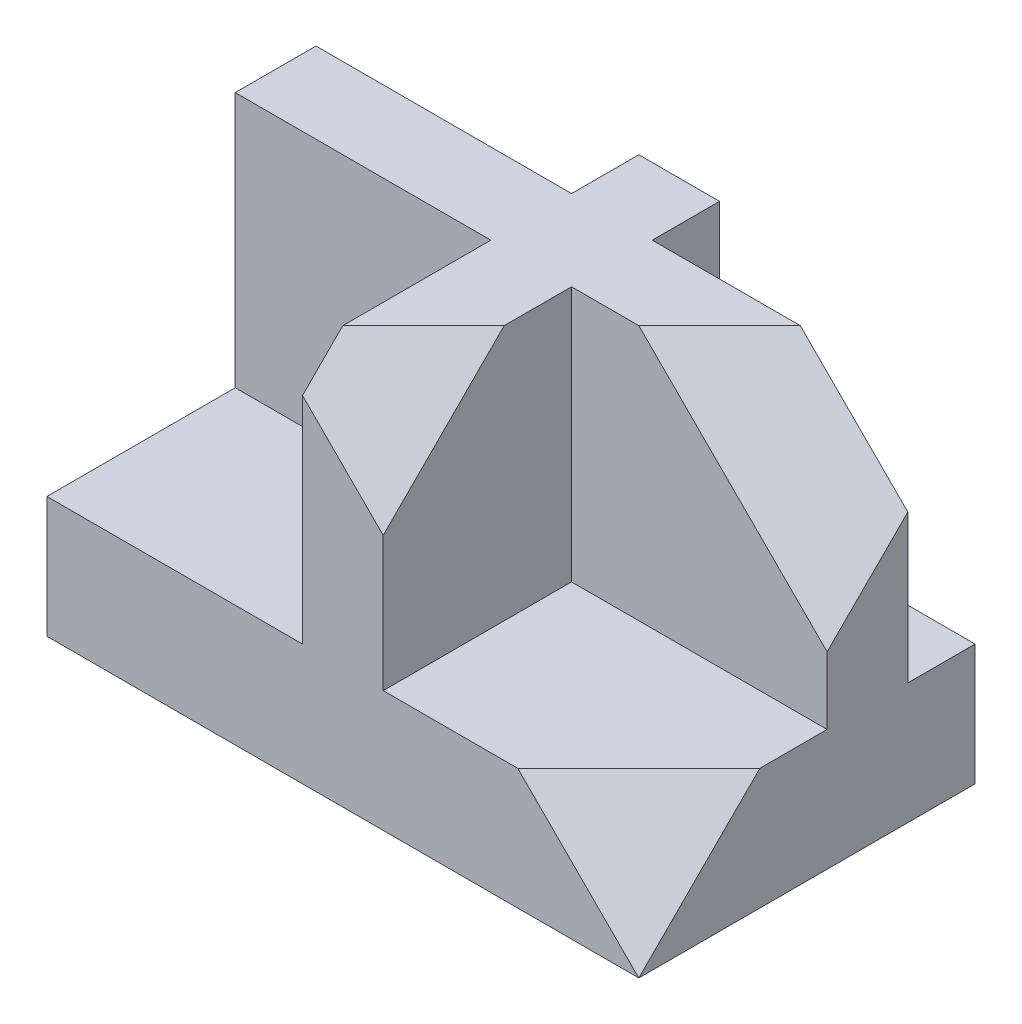
ISO-10303-21;
HEADER;
FILE_DESCRIPTION(('STEP AP214'),'2;1');
FILE_NAME('part.step','',(''),(''),'','','');
FILE_SCHEMA(('AUTOMOTIVE_DESIGN { 1 0 10303 214 1 1 1 1 }'));
ENDSEC;
DATA;
#1=APPLICATION_CONTEXT('core data for automotive mechanical design processes');
#2=APPLICATION_PROTOCOL_DEFINITION('international standard','automotive_design',2000,#1);
#3=PRODUCT_CONTEXT('',#1,'mechanical');
#4=PRODUCT('Part','Part','',(#3));
#5=PRODUCT_RELATED_PRODUCT_CATEGORY('part','',(#4));
#6=PRODUCT_DEFINITION_FORMATION('','',#4);
#7=PRODUCT_DEFINITION_CONTEXT('part definition',#1,'design');
#8=PRODUCT_DEFINITION('design','',#6,#7);
#9=PRODUCT_DEFINITION_SHAPE('','',#8);
#10=(LENGTH_UNIT() NAMED_UNIT(*) SI_UNIT(.MILLI.,.METRE.));
#11=(NAMED_UNIT(*) PLANE_ANGLE_UNIT() SI_UNIT($,.RADIAN.));
#12=(NAMED_UNIT(*) SI_UNIT($,.STERADIAN.) SOLID_ANGLE_UNIT());
#13=UNCERTAINTY_MEASURE_WITH_UNIT(LENGTH_MEASURE(1.E-05),#10,'distance_accuracy_value','');
#14=(GEOMETRIC_REPRESENTATION_CONTEXT(3) GLOBAL_UNCERTAINTY_ASSIGNED_CONTEXT((#13)) GLOBAL_UNIT_ASSIGNED_CONTEXT((#10,
#11,#12)) REPRESENTATION_CONTEXT('',''));
#15=CARTESIAN_POINT('',(0.,0.,0.));
#16=DIRECTION('',(0.,0.,1.));
#17=DIRECTION('',(1.,0.,0.));
#18=AXIS2_PLACEMENT_3D('',#15,#16,#17);
#19=CARTESIAN_POINT('',(0.,0.,0.));
#20=DIRECTION('',(0.,1.,0.));
#21=DIRECTION('',(0.,0.,1.));
#22=AXIS2_PLACEMENT_3D('',#19,#20,#21);
#23=PLANE('',#22);
#24=DIRECTION('',(1.,0.,0.));
#25=VECTOR('',#24,1.);
#26=CARTESIAN_POINT('',(0.,0.,25.));
#27=LINE('',#26,#25);
#28=CARTESIAN_POINT('',(6.,0.,25.));
#29=VERTEX_POINT('',#28);
#30=CARTESIAN_POINT('',(25.9999999999998,0.,25.));
#31=VERTEX_POINT('',#30);
#32=EDGE_CURVE('E280',#29,#31,#27,.T.);
#33=ORIENTED_EDGE('',*,*,#32,.T.);
#34=DIRECTION('',(0.707106781186548,0.,-0.707106781186547));
#35=VECTOR('',#34,1.);
#36=CARTESIAN_POINT('',(25.4999999999999,0.,25.4999999999999));
#37=LINE('',#36,#35);
#38=CARTESIAN_POINT('',(44.,0.,6.99999999999985));
#39=VERTEX_POINT('',#38);
#40=EDGE_CURVE('E55',#31,#39,#37,.T.);
#41=ORIENTED_EDGE('',*,*,#40,.T.);
#42=DIRECTION('',(0.,0.,1.));
#43=VECTOR('',#42,1.);
#44=CARTESIAN_POINT('',(44.,0.,0.));
#45=LINE('',#44,#43);
#46=CARTESIAN_POINT('',(44.,0.,-2.99999999999999));
#47=VERTEX_POINT('',#46);
#48=EDGE_CURVE('E284',#47,#39,#45,.T.);
#49=ORIENTED_EDGE('',*,*,#48,.F.);
#50=DIRECTION('',(1.,0.,0.));
#51=VECTOR('',#50,1.);
#52=CARTESIAN_POINT('',(0.,0.,-2.99999999999999));
#53=LINE('',#52,#51);
#54=CARTESIAN_POINT('',(6.,0.,-2.99999999999999));
#55=VERTEX_POINT('',#54);
#56=EDGE_CURVE('E217',#55,#47,#53,.T.);
#57=ORIENTED_EDGE('',*,*,#56,.F.);
#58=DIRECTION('',(0.,0.,1.));
#59=VECTOR('',#58,1.);
#60=CARTESIAN_POINT('',(6.,0.,0.));
#61=LINE('',#60,#59);
#62=EDGE_CURVE('E214',#55,#29,#61,.T.);
#63=ORIENTED_EDGE('',*,*,#62,.T.);
#64=EDGE_LOOP('',(#33,#41,#49,#57,#63));
#65=FACE_BOUND('',#64,.T.);
#66=ADVANCED_FACE('F40',(#65),#23,.T.);
#67=CARTESIAN_POINT('',(44.,-18.,0.));
#68=DIRECTION('',(-1.,0.,0.));
#69=DIRECTION('',(0.,0.,1.));
#70=AXIS2_PLACEMENT_3D('',#67,#68,#69);
#71=PLANE('',#70);
#72=DIRECTION('',(0.,0.707106781186544,-0.707106781186551));
#73=VECTOR('',#72,1.);
#74=CARTESIAN_POINT('',(44.,-5.49999999999998,12.4999999999999));
#75=LINE('',#74,#73);
#76=CARTESIAN_POINT('',(44.,-18.,25.));
#77=VERTEX_POINT('',#76);
#78=EDGE_CURVE('E326',#77,#39,#75,.T.);
#79=ORIENTED_EDGE('',*,*,#78,.F.);
#80=DIRECTION('',(0.,0.,1.));
#81=VECTOR('',#80,1.);
#82=CARTESIAN_POINT('',(44.,-18.,0.));
#83=LINE('',#82,#81);
#84=CARTESIAN_POINT('',(44.,-18.,-25.));
#85=VERTEX_POINT('',#84);
#86=EDGE_CURVE('E270',#85,#77,#83,.T.);
#87=ORIENTED_EDGE('',*,*,#86,.F.);
#88=DIRECTION('',(0.,1.,0.));
#89=VECTOR('',#88,1.);
#90=CARTESIAN_POINT('',(44.,-18.,-25.));
#91=LINE('',#90,#89);
#92=CARTESIAN_POINT('',(44.,0.,-25.));
#93=VERTEX_POINT('',#92);
#94=EDGE_CURVE('E173',#85,#93,#91,.T.);
#95=ORIENTED_EDGE('',*,*,#94,.T.);
#96=CARTESIAN_POINT('',(44.,0.,-15.));
#97=VERTEX_POINT('',#96);
#98=EDGE_CURVE('E264',#93,#97,#45,.T.);
#99=ORIENTED_EDGE('',*,*,#98,.T.);
#100=DIRECTION('',(0.,-1.,0.));
#101=VECTOR('',#100,1.);
#102=CARTESIAN_POINT('',(44.,38.,-15.));
#103=LINE('',#102,#101);
#104=CARTESIAN_POINT('',(44.,21.9999999999996,-15.));
#105=VERTEX_POINT('',#104);
#106=EDGE_CURVE('E244',#105,#97,#103,.T.);
#107=ORIENTED_EDGE('',*,*,#106,.F.);
#108=CARTESIAN_POINT('',(44.,9.99999999999972,-2.99999999999999));
#109=VERTEX_POINT('',#108);
#110=EDGE_CURVE('E183',#109,#105,#75,.T.);
#111=ORIENTED_EDGE('',*,*,#110,.F.);
#112=DIRECTION('',(0.,-1.,0.));
#113=VECTOR('',#112,1.);
#114=CARTESIAN_POINT('',(44.,38.,-2.99999999999999));
#115=LINE('',#114,#113);
#116=EDGE_CURVE('E182',#109,#47,#115,.T.);
#117=ORIENTED_EDGE('',*,*,#116,.T.);
#118=ORIENTED_EDGE('',*,*,#48,.T.);
#119=EDGE_LOOP('',(#79,#87,#95,#99,#107,#111,#117,#118));
#120=FACE_BOUND('',#119,.T.);
#121=ADVANCED_FACE('F323',(#120),#71,.F.);
#122=CARTESIAN_POINT('',(0.,-18.,25.));
#123=DIRECTION('',(0.,0.,1.));
#124=DIRECTION('',(1.,0.,0.));
#125=AXIS2_PLACEMENT_3D('',#122,#123,#124);
#126=PLANE('',#125);
#127=DIRECTION('',(1.,0.,0.));
#128=VECTOR('',#127,1.);
#129=CARTESIAN_POINT('',(0.,-18.,25.));
#130=LINE('',#129,#128);
#131=CARTESIAN_POINT('',(-44.,-18.,25.));
#132=VERTEX_POINT('',#131);
#133=EDGE_CURVE('E267',#132,#77,#130,.T.);
#134=ORIENTED_EDGE('',*,*,#133,.T.);
#135=DIRECTION('',(-0.707106781186551,0.707106781186544,0.));
#136=VECTOR('',#135,1.);
#137=CARTESIAN_POINT('',(21.9999999999998,4.00000000000001,25.));
#138=LINE('',#137,#136);
#139=EDGE_CURVE('E364',#77,#31,#138,.T.);
#140=ORIENTED_EDGE('',*,*,#139,.T.);
#141=ORIENTED_EDGE('',*,*,#32,.F.);
#142=DIRECTION('',(0.,-1.,0.));
#143=VECTOR('',#142,1.);
#144=CARTESIAN_POINT('',(6.,38.,25.));
#145=LINE('',#144,#143);
#146=CARTESIAN_POINT('',(6.,19.9999999999996,25.));
#147=VERTEX_POINT('',#146);
#148=EDGE_CURVE('E249',#147,#29,#145,.T.);
#149=ORIENTED_EDGE('',*,*,#148,.F.);
#150=CARTESIAN_POINT('',(-6.,31.9999999999995,25.));
#151=VERTEX_POINT('',#150);
#152=EDGE_CURVE('E365',#147,#151,#138,.T.);
#153=ORIENTED_EDGE('',*,*,#152,.T.);
#154=DIRECTION('',(0.,-1.,0.));
#155=VECTOR('',#154,1.);
#156=CARTESIAN_POINT('',(-6.,38.,25.));
#157=LINE('',#156,#155);
#158=CARTESIAN_POINT('',(-6.,0.,25.));
#159=VERTEX_POINT('',#158);
#160=EDGE_CURVE('E251',#151,#159,#157,.T.);
#161=ORIENTED_EDGE('',*,*,#160,.T.);
#162=CARTESIAN_POINT('',(-44.,0.,25.));
#163=VERTEX_POINT('',#162);
#164=EDGE_CURVE('E281',#163,#159,#27,.T.);
#165=ORIENTED_EDGE('',*,*,#164,.F.);
#166=DIRECTION('',(0.,1.,0.));
#167=VECTOR('',#166,1.);
#168=CARTESIAN_POINT('',(-44.,-18.,25.));
#169=LINE('',#168,#167);
#170=EDGE_CURVE('E289',#132,#163,#169,.T.);
#171=ORIENTED_EDGE('',*,*,#170,.F.);
#172=EDGE_LOOP('',(#134,#140,#141,#149,#153,#161,#165,#171));
#173=FACE_BOUND('',#172,.T.);
#174=ADVANCED_FACE('F333',(#173),#126,.T.);
#175=CARTESIAN_POINT('',(-6.,38.,0.));
#176=DIRECTION('',(1.,0.,0.));
#177=DIRECTION('',(0.,0.,-1.));
#178=AXIS2_PLACEMENT_3D('',#175,#176,#177);
#179=PLANE('',#178);
#180=DIRECTION('',(0.,-0.707106781186544,0.707106781186551));
#181=VECTOR('',#180,1.);
#182=CARTESIAN_POINT('',(-6.,47.4999999999997,9.49999999999961));
#183=LINE('',#182,#181);
#184=CARTESIAN_POINT('',(-6.,38.,18.9999999999994));
#185=VERTEX_POINT('',#184);
#186=EDGE_CURVE('E362',#185,#151,#183,.T.);
#187=ORIENTED_EDGE('',*,*,#186,.F.);
#188=DIRECTION('',(0.,0.,1.));
#189=VECTOR('',#188,1.);
#190=CARTESIAN_POINT('',(-6.,38.,0.));
#191=LINE('',#190,#189);
#192=CARTESIAN_POINT('',(-6.,38.,-2.99999999999999));
#193=VERTEX_POINT('',#192);
#194=EDGE_CURVE('E193',#193,#185,#191,.T.);
#195=ORIENTED_EDGE('',*,*,#194,.F.);
#196=DIRECTION('',(0.,-1.,0.));
#197=VECTOR('',#196,1.);
#198=CARTESIAN_POINT('',(-6.,38.,-2.99999999999999));
#199=LINE('',#198,#197);
#200=CARTESIAN_POINT('',(-6.,0.,-2.99999999999999));
#201=VERTEX_POINT('',#200);
#202=EDGE_CURVE('E253',#193,#201,#199,.T.);
#203=ORIENTED_EDGE('',*,*,#202,.T.);
#204=DIRECTION('',(0.,0.,1.));
#205=VECTOR('',#204,1.);
#206=CARTESIAN_POINT('',(-6.,0.,0.));
#207=LINE('',#206,#205);
#208=EDGE_CURVE('E211',#201,#159,#207,.T.);
#209=ORIENTED_EDGE('',*,*,#208,.T.);
#210=ORIENTED_EDGE('',*,*,#160,.F.);
#211=EDGE_LOOP('',(#187,#195,#203,#209,#210));
#212=FACE_BOUND('',#211,.T.);
#213=ADVANCED_FACE('F340',(#212),#179,.F.);
#214=CARTESIAN_POINT('',(6.,38.,0.));
#215=DIRECTION('',(1.,0.,0.));
#216=DIRECTION('',(0.,0.,-1.));
#217=AXIS2_PLACEMENT_3D('',#214,#215,#216);
#218=PLANE('',#217);
#219=DIRECTION('',(0.,0.,1.));
#220=VECTOR('',#219,1.);
#221=CARTESIAN_POINT('',(6.,38.,0.));
#222=LINE('',#221,#220);
#223=CARTESIAN_POINT('',(6.,38.,-2.99999999999999));
#224=VERTEX_POINT('',#223);
#225=CARTESIAN_POINT('',(6.,38.,6.99999999999942));
#226=VERTEX_POINT('',#225);
#227=EDGE_CURVE('E188',#224,#226,#222,.T.);
#228=ORIENTED_EDGE('',*,*,#227,.T.);
#229=DIRECTION('',(0.,-0.707106781186544,0.707106781186551));
#230=VECTOR('',#229,1.);
#231=CARTESIAN_POINT('',(6.,41.4999999999997,3.49999999999967));
#232=LINE('',#231,#230);
#233=EDGE_CURVE('E354',#226,#147,#232,.T.);
#234=ORIENTED_EDGE('',*,*,#233,.T.);
#235=ORIENTED_EDGE('',*,*,#148,.T.);
#236=ORIENTED_EDGE('',*,*,#62,.F.);
#237=DIRECTION('',(0.,-1.,0.));
#238=VECTOR('',#237,1.);
#239=CARTESIAN_POINT('',(6.,38.,-2.99999999999999));
#240=LINE('',#239,#238);
#241=EDGE_CURVE('E247',#224,#55,#240,.T.);
#242=ORIENTED_EDGE('',*,*,#241,.F.);
#243=EDGE_LOOP('',(#228,#234,#235,#236,#242));
#244=FACE_BOUND('',#243,.T.);
#245=ADVANCED_FACE('F353',(#244),#218,.T.);
#246=CARTESIAN_POINT('',(0.,38.,-2.99999999999999));
#247=DIRECTION('',(0.,0.,-1.));
#248=DIRECTION('',(-1.,0.,0.));
#249=AXIS2_PLACEMENT_3D('',#246,#247,#248);
#250=PLANE('',#249);
#251=DIRECTION('',(0.707106781186551,-0.707106781186544,0.));
#252=VECTOR('',#251,1.);
#253=CARTESIAN_POINT('',(7.99999999999962,45.9999999999997,-2.99999999999999));
#254=LINE('',#253,#252);
#255=CARTESIAN_POINT('',(15.9999999999994,38.,-2.99999999999999));
#256=VERTEX_POINT('',#255);
#257=EDGE_CURVE('E167',#256,#109,#254,.T.);
#258=ORIENTED_EDGE('',*,*,#257,.F.);
#259=DIRECTION('',(1.,0.,0.));
#260=VECTOR('',#259,1.);
#261=CARTESIAN_POINT('',(0.,38.,-2.99999999999999));
#262=LINE('',#261,#260);
#263=EDGE_CURVE('E179',#224,#256,#262,.T.);
#264=ORIENTED_EDGE('',*,*,#263,.F.);
#265=ORIENTED_EDGE('',*,*,#241,.T.);
#266=ORIENTED_EDGE('',*,*,#56,.T.);
#267=ORIENTED_EDGE('',*,*,#116,.F.);
#268=EDGE_LOOP('',(#258,#264,#265,#266,#267));
#269=FACE_BOUND('',#268,.T.);
#270=ADVANCED_FACE('F177',(#269),#250,.F.);
#271=CARTESIAN_POINT('',(0.,38.,-15.));
#272=DIRECTION('',(0.,0.,-1.));
#273=DIRECTION('',(-1.,0.,0.));
#274=AXIS2_PLACEMENT_3D('',#271,#272,#273);
#275=PLANE('',#274);
#276=DIRECTION('',(1.,0.,0.));
#277=VECTOR('',#276,1.);
#278=CARTESIAN_POINT('',(0.,38.,-15.));
#279=LINE('',#278,#277);
#280=CARTESIAN_POINT('',(6.,38.,-15.));
#281=VERTEX_POINT('',#280);
#282=CARTESIAN_POINT('',(27.9999999999994,38.,-15.));
#283=VERTEX_POINT('',#282);
#284=EDGE_CURVE('E189',#281,#283,#279,.T.);
#285=ORIENTED_EDGE('',*,*,#284,.T.);
#286=DIRECTION('',(0.707106781186551,-0.707106781186544,0.));
#287=VECTOR('',#286,1.);
#288=CARTESIAN_POINT('',(13.9999999999996,51.9999999999997,-15.));
#289=LINE('',#288,#287);
#290=EDGE_CURVE('E63',#283,#105,#289,.T.);
#291=ORIENTED_EDGE('',*,*,#290,.T.);
#292=ORIENTED_EDGE('',*,*,#106,.T.);
#293=DIRECTION('',(1.,0.,0.));
#294=VECTOR('',#293,1.);
#295=CARTESIAN_POINT('',(0.,0.,-15.));
#296=LINE('',#295,#294);
#297=CARTESIAN_POINT('',(6.,0.,-15.));
#298=VERTEX_POINT('',#297);
#299=EDGE_CURVE('E219',#298,#97,#296,.T.);
#300=ORIENTED_EDGE('',*,*,#299,.F.);
#301=DIRECTION('',(0.,-1.,0.));
#302=VECTOR('',#301,1.);
#303=CARTESIAN_POINT('',(6.,38.,-15.));
#304=LINE('',#303,#302);
#305=EDGE_CURVE('E241',#281,#298,#304,.T.);
#306=ORIENTED_EDGE('',*,*,#305,.F.);
#307=EDGE_LOOP('',(#285,#291,#292,#300,#306));
#308=FACE_BOUND('',#307,.T.);
#309=ADVANCED_FACE('F412',(#308),#275,.T.);
#310=CARTESIAN_POINT('',(0.,38.,0.));
#311=DIRECTION('',(0.,1.,0.));
#312=DIRECTION('',(0.,0.,1.));
#313=AXIS2_PLACEMENT_3D('',#310,#311,#312);
#314=PLANE('',#313);
#315=ORIENTED_EDGE('',*,*,#194,.T.);
#316=DIRECTION('',(0.707106781186548,0.,-0.707106781186547));
#317=VECTOR('',#316,1.);
#318=CARTESIAN_POINT('',(6.49999999999971,38.,6.49999999999971));
#319=LINE('',#318,#317);
#320=EDGE_CURVE('E12',#185,#226,#319,.T.);
#321=ORIENTED_EDGE('',*,*,#320,.T.);
#322=ORIENTED_EDGE('',*,*,#227,.F.);
#323=ORIENTED_EDGE('',*,*,#263,.T.);
#324=EDGE_CURVE('E44',#256,#283,#319,.T.);
#325=ORIENTED_EDGE('',*,*,#324,.T.);
#326=ORIENTED_EDGE('',*,*,#284,.F.);
#327=DIRECTION('',(0.,0.,1.));
#328=VECTOR('',#327,1.);
#329=CARTESIAN_POINT('',(6.,38.,0.));
#330=LINE('',#329,#328);
#331=CARTESIAN_POINT('',(5.99999999999999,38.,-25.));
#332=VERTEX_POINT('',#331);
#333=EDGE_CURVE('E191',#332,#281,#330,.T.);
#334=ORIENTED_EDGE('',*,*,#333,.F.);
#335=DIRECTION('',(1.,0.,0.));
#336=VECTOR('',#335,1.);
#337=CARTESIAN_POINT('',(0.,38.,-25.));
#338=LINE('',#337,#336);
#339=CARTESIAN_POINT('',(-6.00000000000001,38.,-25.));
#340=VERTEX_POINT('',#339);
#341=EDGE_CURVE('E199',#340,#332,#338,.T.);
#342=ORIENTED_EDGE('',*,*,#341,.F.);
#343=DIRECTION('',(0.,0.,1.));
#344=VECTOR('',#343,1.);
#345=CARTESIAN_POINT('',(-6.,38.,0.));
#346=LINE('',#345,#344);
#347=CARTESIAN_POINT('',(-6.,38.,-15.));
#348=VERTEX_POINT('',#347);
#349=EDGE_CURVE('E202',#340,#348,#346,.T.);
#350=ORIENTED_EDGE('',*,*,#349,.T.);
#351=DIRECTION('',(1.,0.,0.));
#352=VECTOR('',#351,1.);
#353=CARTESIAN_POINT('',(0.,38.,-15.));
#354=LINE('',#353,#352);
#355=CARTESIAN_POINT('',(-44.,38.,-15.));
#356=VERTEX_POINT('',#355);
#357=EDGE_CURVE('E204',#356,#348,#354,.T.);
#358=ORIENTED_EDGE('',*,*,#357,.F.);
#359=DIRECTION('',(0.,0.,1.));
#360=VECTOR('',#359,1.);
#361=CARTESIAN_POINT('',(-44.,38.,0.));
#362=LINE('',#361,#360);
#363=CARTESIAN_POINT('',(-44.,38.,-2.99999999999999));
#364=VERTEX_POINT('',#363);
#365=EDGE_CURVE('E229',#356,#364,#362,.T.);
#366=ORIENTED_EDGE('',*,*,#365,.T.);
#367=DIRECTION('',(1.,0.,0.));
#368=VECTOR('',#367,1.);
#369=CARTESIAN_POINT('',(0.,38.,-2.99999999999999));
#370=LINE('',#369,#368);
#371=EDGE_CURVE('E345',#364,#193,#370,.T.);
#372=ORIENTED_EDGE('',*,*,#371,.T.);
#373=EDGE_LOOP('',(#315,#321,#322,#323,#325,#326,#334,#342,#350,#358,#366,#372));
#374=FACE_BOUND('',#373,.T.);
#375=ADVANCED_FACE('F186',(#374),#314,.T.);
#376=DIRECTION('',(0.,0.,1.));
#377=VECTOR('',#376,1.);
#378=CARTESIAN_POINT('',(-44.,0.,0.));
#379=LINE('',#378,#377);
#380=CARTESIAN_POINT('',(-44.,0.,-25.));
#381=VERTEX_POINT('',#380);
#382=CARTESIAN_POINT('',(-44.,0.,-15.));
#383=VERTEX_POINT('',#382);
#384=EDGE_CURVE('E278',#381,#383,#379,.T.);
#385=ORIENTED_EDGE('',*,*,#384,.T.);
#386=DIRECTION('',(1.,0.,0.));
#387=VECTOR('',#386,1.);
#388=CARTESIAN_POINT('',(0.,0.,-15.));
#389=LINE('',#388,#387);
#390=CARTESIAN_POINT('',(-6.,0.,-15.));
#391=VERTEX_POINT('',#390);
#392=EDGE_CURVE('E227',#383,#391,#389,.T.);
#393=ORIENTED_EDGE('',*,*,#392,.T.);
#394=DIRECTION('',(0.,0.,1.));
#395=VECTOR('',#394,1.);
#396=CARTESIAN_POINT('',(-6.,0.,0.));
#397=LINE('',#396,#395);
#398=CARTESIAN_POINT('',(-6.,0.,-25.));
#399=VERTEX_POINT('',#398);
#400=EDGE_CURVE('E224',#399,#391,#397,.T.);
#401=ORIENTED_EDGE('',*,*,#400,.F.);
#402=DIRECTION('',(1.,0.,0.));
#403=VECTOR('',#402,1.);
#404=CARTESIAN_POINT('',(0.,0.,-25.));
#405=LINE('',#404,#403);
#406=EDGE_CURVE('E274',#381,#399,#405,.T.);
#407=ORIENTED_EDGE('',*,*,#406,.F.);
#408=EDGE_LOOP('',(#385,#393,#401,#407));
#409=FACE_BOUND('',#408,.T.);
#410=ADVANCED_FACE('F299',(#409),#23,.T.);
#411=CARTESIAN_POINT('',(6.,0.,-25.));
#412=VERTEX_POINT('',#411);
#413=EDGE_CURVE('E259',#412,#93,#405,.T.);
#414=ORIENTED_EDGE('',*,*,#413,.F.);
#415=DIRECTION('',(0.,0.,1.));
#416=VECTOR('',#415,1.);
#417=CARTESIAN_POINT('',(6.,0.,0.));
#418=LINE('',#417,#416);
#419=EDGE_CURVE('E222',#412,#298,#418,.T.);
#420=ORIENTED_EDGE('',*,*,#419,.T.);
#421=ORIENTED_EDGE('',*,*,#299,.T.);
#422=ORIENTED_EDGE('',*,*,#98,.F.);
#423=EDGE_LOOP('',(#414,#420,#421,#422));
#424=FACE_BOUND('',#423,.T.);
#425=ADVANCED_FACE('F319',(#424),#23,.T.);
#426=CARTESIAN_POINT('',(0.,-18.,-25.));
#427=DIRECTION('',(0.,0.,1.));
#428=DIRECTION('',(1.,0.,0.));
#429=AXIS2_PLACEMENT_3D('',#426,#427,#428);
#430=PLANE('',#429);
#431=ORIENTED_EDGE('',*,*,#406,.T.);
#432=DIRECTION('',(0.,-1.,0.));
#433=VECTOR('',#432,1.);
#434=CARTESIAN_POINT('',(-6.00000000000001,38.,-25.));
#435=LINE('',#434,#433);
#436=EDGE_CURVE('E235',#340,#399,#435,.T.);
#437=ORIENTED_EDGE('',*,*,#436,.F.);
#438=ORIENTED_EDGE('',*,*,#341,.T.);
#439=DIRECTION('',(0.,-1.,0.));
#440=VECTOR('',#439,1.);
#441=CARTESIAN_POINT('',(5.99999999999999,38.,-25.));
#442=LINE('',#441,#440);
#443=EDGE_CURVE('E238',#332,#412,#442,.T.);
#444=ORIENTED_EDGE('',*,*,#443,.T.);
#445=ORIENTED_EDGE('',*,*,#413,.T.);
#446=ORIENTED_EDGE('',*,*,#94,.F.);
#447=DIRECTION('',(1.,0.,0.));
#448=VECTOR('',#447,1.);
#449=CARTESIAN_POINT('',(0.,-18.,-25.));
#450=LINE('',#449,#448);
#451=CARTESIAN_POINT('',(-44.,-18.,-25.));
#452=VERTEX_POINT('',#451);
#453=EDGE_CURVE('E260',#452,#85,#450,.T.);
#454=ORIENTED_EDGE('',*,*,#453,.F.);
#455=DIRECTION('',(0.,1.,0.));
#456=VECTOR('',#455,1.);
#457=CARTESIAN_POINT('',(-44.,-18.,-25.));
#458=LINE('',#457,#456);
#459=EDGE_CURVE('E273',#452,#381,#458,.T.);
#460=ORIENTED_EDGE('',*,*,#459,.T.);
#461=EDGE_LOOP('',(#431,#437,#438,#444,#445,#446,#454,#460));
#462=FACE_BOUND('',#461,.T.);
#463=ADVANCED_FACE('F42',(#462),#430,.F.);
#464=CARTESIAN_POINT('',(-44.,-18.,0.));
#465=DIRECTION('',(-1.,0.,0.));
#466=DIRECTION('',(0.,0.,1.));
#467=AXIS2_PLACEMENT_3D('',#464,#465,#466);
#468=PLANE('',#467);
#469=ORIENTED_EDGE('',*,*,#384,.F.);
#470=ORIENTED_EDGE('',*,*,#459,.F.);
#471=DIRECTION('',(0.,0.,1.));
#472=VECTOR('',#471,1.);
#473=CARTESIAN_POINT('',(-44.,-18.,0.));
#474=LINE('',#473,#472);
#475=EDGE_CURVE('E263',#452,#132,#474,.T.);
#476=ORIENTED_EDGE('',*,*,#475,.T.);
#477=ORIENTED_EDGE('',*,*,#170,.T.);
#478=CARTESIAN_POINT('',(-44.,0.,-2.99999999999999));
#479=VERTEX_POINT('',#478);
#480=EDGE_CURVE('E277',#479,#163,#379,.T.);
#481=ORIENTED_EDGE('',*,*,#480,.F.);
#482=DIRECTION('',(0.,-1.,0.));
#483=VECTOR('',#482,1.);
#484=CARTESIAN_POINT('',(-44.,38.,-2.99999999999999));
#485=LINE('',#484,#483);
#486=EDGE_CURVE('E256',#364,#479,#485,.T.);
#487=ORIENTED_EDGE('',*,*,#486,.F.);
#488=ORIENTED_EDGE('',*,*,#365,.F.);
#489=DIRECTION('',(0.,-1.,0.));
#490=VECTOR('',#489,1.);
#491=CARTESIAN_POINT('',(-44.,38.,-15.));
#492=LINE('',#491,#490);
#493=EDGE_CURVE('E207',#356,#383,#492,.T.);
#494=ORIENTED_EDGE('',*,*,#493,.T.);
#495=EDGE_LOOP('',(#469,#470,#476,#477,#481,#487,#488,#494));
#496=FACE_BOUND('',#495,.T.);
#497=ADVANCED_FACE('F300',(#496),#468,.T.);
#498=CARTESIAN_POINT('',(0.,-18.,0.));
#499=DIRECTION('',(0.,1.,0.));
#500=DIRECTION('',(0.,0.,1.));
#501=AXIS2_PLACEMENT_3D('',#498,#499,#500);
#502=PLANE('',#501);
#503=ORIENTED_EDGE('',*,*,#453,.T.);
#504=ORIENTED_EDGE('',*,*,#86,.T.);
#505=ORIENTED_EDGE('',*,*,#133,.F.);
#506=ORIENTED_EDGE('',*,*,#475,.F.);
#507=EDGE_LOOP('',(#503,#504,#505,#506));
#508=FACE_BOUND('',#507,.T.);
#509=ADVANCED_FACE('F329',(#508),#502,.F.);
#510=ORIENTED_EDGE('',*,*,#208,.F.);
#511=DIRECTION('',(1.,0.,0.));
#512=VECTOR('',#511,1.);
#513=CARTESIAN_POINT('',(0.,0.,-2.99999999999999));
#514=LINE('',#513,#512);
#515=EDGE_CURVE('E208',#479,#201,#514,.T.);
#516=ORIENTED_EDGE('',*,*,#515,.F.);
#517=ORIENTED_EDGE('',*,*,#480,.T.);
#518=ORIENTED_EDGE('',*,*,#164,.T.);
#519=EDGE_LOOP('',(#510,#516,#517,#518));
#520=FACE_BOUND('',#519,.T.);
#521=ADVANCED_FACE('F337',(#520),#23,.T.);
#522=CARTESIAN_POINT('',(0.,38.,-2.99999999999999));
#523=DIRECTION('',(0.,0.,-1.));
#524=DIRECTION('',(-1.,0.,0.));
#525=AXIS2_PLACEMENT_3D('',#522,#523,#524);
#526=PLANE('',#525);
#527=ORIENTED_EDGE('',*,*,#515,.T.);
#528=ORIENTED_EDGE('',*,*,#202,.F.);
#529=ORIENTED_EDGE('',*,*,#371,.F.);
#530=ORIENTED_EDGE('',*,*,#486,.T.);
#531=EDGE_LOOP('',(#527,#528,#529,#530));
#532=FACE_BOUND('',#531,.T.);
#533=ADVANCED_FACE('F344',(#532),#526,.F.);
#534=CARTESIAN_POINT('',(6.,38.,0.));
#535=DIRECTION('',(1.,0.,0.));
#536=DIRECTION('',(0.,0.,-1.));
#537=AXIS2_PLACEMENT_3D('',#534,#535,#536);
#538=PLANE('',#537);
#539=ORIENTED_EDGE('',*,*,#419,.F.);
#540=ORIENTED_EDGE('',*,*,#443,.F.);
#541=ORIENTED_EDGE('',*,*,#333,.T.);
#542=ORIENTED_EDGE('',*,*,#305,.T.);
#543=EDGE_LOOP('',(#539,#540,#541,#542));
#544=FACE_BOUND('',#543,.T.);
#545=ADVANCED_FACE('F316',(#544),#538,.T.);
#546=CARTESIAN_POINT('',(-6.,38.,0.));
#547=DIRECTION('',(1.,0.,0.));
#548=DIRECTION('',(0.,0.,-1.));
#549=AXIS2_PLACEMENT_3D('',#546,#547,#548);
#550=PLANE('',#549);
#551=ORIENTED_EDGE('',*,*,#400,.T.);
#552=DIRECTION('',(0.,-1.,0.));
#553=VECTOR('',#552,1.);
#554=CARTESIAN_POINT('',(-6.,38.,-15.));
#555=LINE('',#554,#553);
#556=EDGE_CURVE('E232',#348,#391,#555,.T.);
#557=ORIENTED_EDGE('',*,*,#556,.F.);
#558=ORIENTED_EDGE('',*,*,#349,.F.);
#559=ORIENTED_EDGE('',*,*,#436,.T.);
#560=EDGE_LOOP('',(#551,#557,#558,#559));
#561=FACE_BOUND('',#560,.T.);
#562=ADVANCED_FACE('F311',(#561),#550,.F.);
#563=CARTESIAN_POINT('',(0.,38.,-15.));
#564=DIRECTION('',(0.,0.,-1.));
#565=DIRECTION('',(-1.,0.,0.));
#566=AXIS2_PLACEMENT_3D('',#563,#564,#565);
#567=PLANE('',#566);
#568=ORIENTED_EDGE('',*,*,#392,.F.);
#569=ORIENTED_EDGE('',*,*,#493,.F.);
#570=ORIENTED_EDGE('',*,*,#357,.T.);
#571=ORIENTED_EDGE('',*,*,#556,.T.);
#572=EDGE_LOOP('',(#568,#569,#570,#571));
#573=FACE_BOUND('',#572,.T.);
#574=ADVANCED_FACE('F307',(#573),#567,.T.);
#575=CARTESIAN_POINT('',(16.9999999999998,17.,16.9999999999998));
#576=DIRECTION('',(0.577350269189624,0.57735026918963,0.577350269189624));
#577=DIRECTION('',(0.,-0.707106781186544,0.707106781186551));
#578=AXIS2_PLACEMENT_3D('',#575,#576,#577);
#579=PLANE('',#578);
#580=ORIENTED_EDGE('',*,*,#257,.T.);
#581=ORIENTED_EDGE('',*,*,#110,.T.);
#582=ORIENTED_EDGE('',*,*,#290,.F.);
#583=ORIENTED_EDGE('',*,*,#324,.F.);
#584=EDGE_LOOP('',(#580,#581,#582,#583));
#585=FACE_BOUND('',#584,.T.);
#586=ADVANCED_FACE('F166',(#585),#579,.T.);
#587=ORIENTED_EDGE('',*,*,#152,.F.);
#588=ORIENTED_EDGE('',*,*,#233,.F.);
#589=ORIENTED_EDGE('',*,*,#320,.F.);
#590=ORIENTED_EDGE('',*,*,#186,.T.);
#591=EDGE_LOOP('',(#587,#588,#589,#590));
#592=FACE_BOUND('',#591,.T.);
#593=ADVANCED_FACE('F367',(#592),#579,.T.);
#594=ORIENTED_EDGE('',*,*,#40,.F.);
#595=ORIENTED_EDGE('',*,*,#139,.F.);
#596=ORIENTED_EDGE('',*,*,#78,.T.);
#597=EDGE_LOOP('',(#594,#595,#596));
#598=FACE_BOUND('',#597,.T.);
#599=ADVANCED_FACE('F369',(#598),#579,.T.);
#600=CLOSED_SHELL('',(#66,#121,#174,#213,#245,#270,#309,#375,#410,#425,#463,#497,#509,#521,#533,
#545,#562,#574,#586,#593,#599));
#601=MANIFOLD_SOLID_BREP('B2',#600);
#602=ADVANCED_BREP_SHAPE_REPRESENTATION('',(#18,#601),#14);
#603=SHAPE_DEFINITION_REPRESENTATION(#9,#602);
ENDSEC;
END-ISO-10303-21;
